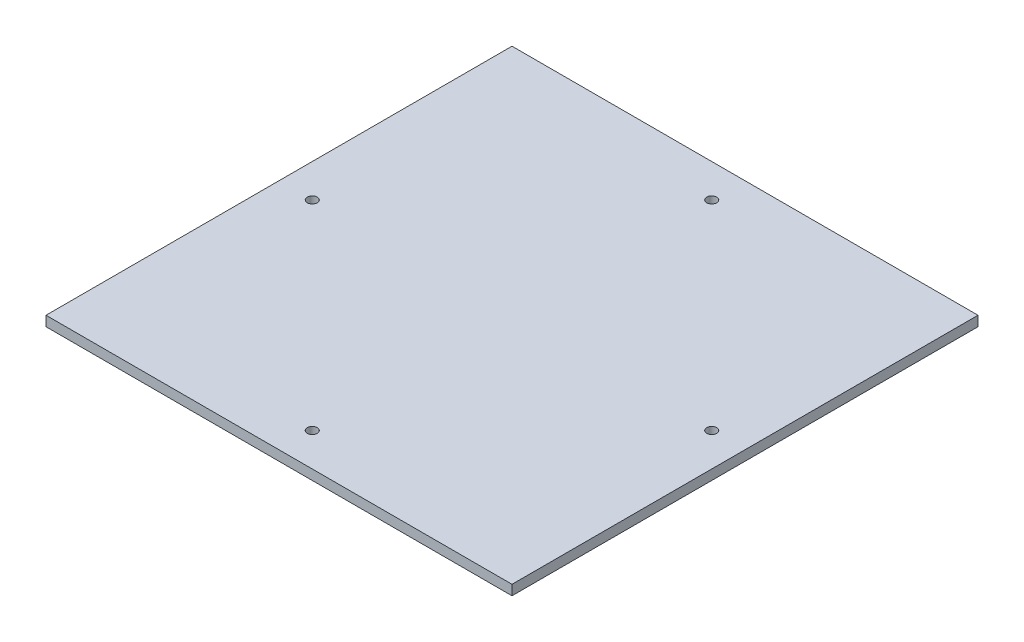
ISO-10303-21;
HEADER;
FILE_DESCRIPTION(('STEP AP214'),'2;1');
FILE_NAME('part.step','',(''),(''),'','','');
FILE_SCHEMA(('AUTOMOTIVE_DESIGN { 1 0 10303 214 1 1 1 1 }'));
ENDSEC;
DATA;
#1=APPLICATION_CONTEXT('core data for automotive mechanical design processes');
#2=APPLICATION_PROTOCOL_DEFINITION('international standard','automotive_design',2000,#1);
#3=PRODUCT_CONTEXT('',#1,'mechanical');
#4=PRODUCT('Part','Part','',(#3));
#5=PRODUCT_RELATED_PRODUCT_CATEGORY('part','',(#4));
#6=PRODUCT_DEFINITION_FORMATION('','',#4);
#7=PRODUCT_DEFINITION_CONTEXT('part definition',#1,'design');
#8=PRODUCT_DEFINITION('design','',#6,#7);
#9=PRODUCT_DEFINITION_SHAPE('','',#8);
#10=(LENGTH_UNIT() NAMED_UNIT(*) SI_UNIT(.MILLI.,.METRE.));
#11=(NAMED_UNIT(*) PLANE_ANGLE_UNIT() SI_UNIT($,.RADIAN.));
#12=(NAMED_UNIT(*) SI_UNIT($,.STERADIAN.) SOLID_ANGLE_UNIT());
#13=UNCERTAINTY_MEASURE_WITH_UNIT(LENGTH_MEASURE(1.E-05),#10,'distance_accuracy_value','');
#14=(GEOMETRIC_REPRESENTATION_CONTEXT(3) GLOBAL_UNCERTAINTY_ASSIGNED_CONTEXT((#13)) GLOBAL_UNIT_ASSIGNED_CONTEXT((#10,
#11,#12)) REPRESENTATION_CONTEXT('',''));
#15=CARTESIAN_POINT('',(0.,0.,0.));
#16=DIRECTION('',(0.,0.,1.));
#17=DIRECTION('',(1.,0.,0.));
#18=AXIS2_PLACEMENT_3D('',#15,#16,#17);
#19=CARTESIAN_POINT('',(-70.,3.,70.));
#20=DIRECTION('',(1.,0.,0.));
#21=DIRECTION('',(0.,0.,-1.));
#22=AXIS2_PLACEMENT_3D('',#19,#20,#21);
#23=PLANE('',#22);
#24=DIRECTION('',(0.,0.,1.));
#25=VECTOR('',#24,1.);
#26=CARTESIAN_POINT('',(-70.,0.,70.));
#27=LINE('',#26,#25);
#28=CARTESIAN_POINT('',(-70.,0.,-70.));
#29=VERTEX_POINT('',#28);
#30=CARTESIAN_POINT('',(-70.,0.,70.));
#31=VERTEX_POINT('',#30);
#32=EDGE_CURVE('E110',#29,#31,#27,.T.);
#33=ORIENTED_EDGE('',*,*,#32,.T.);
#34=DIRECTION('',(0.,-1.,0.));
#35=VECTOR('',#34,1.);
#36=CARTESIAN_POINT('',(-70.,3.,70.));
#37=LINE('',#36,#35);
#38=CARTESIAN_POINT('',(-70.,3.,70.));
#39=VERTEX_POINT('',#38);
#40=EDGE_CURVE('E11',#39,#31,#37,.T.);
#41=ORIENTED_EDGE('',*,*,#40,.F.);
#42=DIRECTION('',(0.,0.,1.));
#43=VECTOR('',#42,1.);
#44=CARTESIAN_POINT('',(-70.,3.,70.));
#45=LINE('',#44,#43);
#46=CARTESIAN_POINT('',(-70.,3.,-70.));
#47=VERTEX_POINT('',#46);
#48=EDGE_CURVE('E94',#47,#39,#45,.T.);
#49=ORIENTED_EDGE('',*,*,#48,.F.);
#50=DIRECTION('',(0.,-1.,0.));
#51=VECTOR('',#50,1.);
#52=CARTESIAN_POINT('',(-70.,3.,-70.));
#53=LINE('',#52,#51);
#54=EDGE_CURVE('E106',#47,#29,#53,.T.);
#55=ORIENTED_EDGE('',*,*,#54,.T.);
#56=EDGE_LOOP('',(#33,#41,#49,#55));
#57=FACE_BOUND('',#56,.T.);
#58=ADVANCED_FACE('F42',(#57),#23,.F.);
#59=CARTESIAN_POINT('',(70.,3.,70.));
#60=DIRECTION('',(0.,0.,-1.));
#61=DIRECTION('',(-1.,0.,0.));
#62=AXIS2_PLACEMENT_3D('',#59,#60,#61);
#63=PLANE('',#62);
#64=DIRECTION('',(1.,0.,0.));
#65=VECTOR('',#64,1.);
#66=CARTESIAN_POINT('',(70.,0.,70.));
#67=LINE('',#66,#65);
#68=CARTESIAN_POINT('',(70.,0.,70.));
#69=VERTEX_POINT('',#68);
#70=EDGE_CURVE('E99',#31,#69,#67,.T.);
#71=ORIENTED_EDGE('',*,*,#70,.T.);
#72=DIRECTION('',(0.,-1.,0.));
#73=VECTOR('',#72,1.);
#74=CARTESIAN_POINT('',(70.,3.,70.));
#75=LINE('',#74,#73);
#76=CARTESIAN_POINT('',(70.,3.,70.));
#77=VERTEX_POINT('',#76);
#78=EDGE_CURVE('E51',#77,#69,#75,.T.);
#79=ORIENTED_EDGE('',*,*,#78,.F.);
#80=DIRECTION('',(1.,0.,0.));
#81=VECTOR('',#80,1.);
#82=CARTESIAN_POINT('',(70.,3.,70.));
#83=LINE('',#82,#81);
#84=EDGE_CURVE('E89',#39,#77,#83,.T.);
#85=ORIENTED_EDGE('',*,*,#84,.F.);
#86=ORIENTED_EDGE('',*,*,#40,.T.);
#87=EDGE_LOOP('',(#71,#79,#85,#86));
#88=FACE_BOUND('',#87,.T.);
#89=ADVANCED_FACE('F98',(#88),#63,.F.);
#90=CARTESIAN_POINT('',(70.,3.,70.));
#91=DIRECTION('',(-1.,0.,0.));
#92=DIRECTION('',(0.,0.,1.));
#93=AXIS2_PLACEMENT_3D('',#90,#91,#92);
#94=PLANE('',#93);
#95=DIRECTION('',(0.,0.,-1.));
#96=VECTOR('',#95,1.);
#97=CARTESIAN_POINT('',(70.,0.,70.));
#98=LINE('',#97,#96);
#99=CARTESIAN_POINT('',(70.,0.,-70.));
#100=VERTEX_POINT('',#99);
#101=EDGE_CURVE('E76',#69,#100,#98,.T.);
#102=ORIENTED_EDGE('',*,*,#101,.T.);
#103=DIRECTION('',(0.,-1.,0.));
#104=VECTOR('',#103,1.);
#105=CARTESIAN_POINT('',(70.,3.,-70.));
#106=LINE('',#105,#104);
#107=CARTESIAN_POINT('',(70.,3.,-70.));
#108=VERTEX_POINT('',#107);
#109=EDGE_CURVE('E101',#108,#100,#106,.T.);
#110=ORIENTED_EDGE('',*,*,#109,.F.);
#111=DIRECTION('',(0.,0.,-1.));
#112=VECTOR('',#111,1.);
#113=CARTESIAN_POINT('',(70.,3.,70.));
#114=LINE('',#113,#112);
#115=EDGE_CURVE('E92',#77,#108,#114,.T.);
#116=ORIENTED_EDGE('',*,*,#115,.F.);
#117=ORIENTED_EDGE('',*,*,#78,.T.);
#118=EDGE_LOOP('',(#102,#110,#116,#117));
#119=FACE_BOUND('',#118,.T.);
#120=ADVANCED_FACE('F102',(#119),#94,.F.);
#121=CARTESIAN_POINT('',(70.,3.,-70.));
#122=DIRECTION('',(0.,0.,1.));
#123=DIRECTION('',(1.,0.,0.));
#124=AXIS2_PLACEMENT_3D('',#121,#122,#123);
#125=PLANE('',#124);
#126=DIRECTION('',(-1.,0.,0.));
#127=VECTOR('',#126,1.);
#128=CARTESIAN_POINT('',(70.,0.,-70.));
#129=LINE('',#128,#127);
#130=EDGE_CURVE('E82',#100,#29,#129,.T.);
#131=ORIENTED_EDGE('',*,*,#130,.T.);
#132=ORIENTED_EDGE('',*,*,#54,.F.);
#133=DIRECTION('',(-1.,0.,0.));
#134=VECTOR('',#133,1.);
#135=CARTESIAN_POINT('',(70.,3.,-70.));
#136=LINE('',#135,#134);
#137=EDGE_CURVE('E59',#108,#47,#136,.T.);
#138=ORIENTED_EDGE('',*,*,#137,.F.);
#139=ORIENTED_EDGE('',*,*,#109,.T.);
#140=EDGE_LOOP('',(#131,#132,#138,#139));
#141=FACE_BOUND('',#140,.T.);
#142=ADVANCED_FACE('F124',(#141),#125,.F.);
#143=CARTESIAN_POINT('',(0.,3.,0.));
#144=DIRECTION('',(0.,1.,0.));
#145=DIRECTION('',(0.,0.,1.));
#146=AXIS2_PLACEMENT_3D('',#143,#144,#145);
#147=PLANE('',#146);
#148=CARTESIAN_POINT('',(-6.42344428799579E-13,3.,-60.));
#149=DIRECTION('',(0.,1.,0.));
#150=DIRECTION('',(0.,0.,1.));
#151=AXIS2_PLACEMENT_3D('',#148,#149,#150);
#152=CIRCLE('',#151,1.5);
#153=CARTESIAN_POINT('',(-6.42344428799579E-13,3.,-58.5));
#154=VERTEX_POINT('',#153);
#155=EDGE_CURVE('E155',#154,#154,#152,.T.);
#156=ORIENTED_EDGE('',*,*,#155,.F.);
#157=EDGE_LOOP('',(#156));
#158=FACE_BOUND('',#157,.T.);
#159=CARTESIAN_POINT('',(60.,3.,-4.32855548468991E-13));
#160=DIRECTION('',(0.,1.,0.));
#161=DIRECTION('',(0.,0.,1.));
#162=AXIS2_PLACEMENT_3D('',#159,#160,#161);
#163=CIRCLE('',#162,1.5);
#164=CARTESIAN_POINT('',(60.,3.,1.49999999999956));
#165=VERTEX_POINT('',#164);
#166=EDGE_CURVE('E151',#165,#165,#163,.T.);
#167=ORIENTED_EDGE('',*,*,#166,.F.);
#168=EDGE_LOOP('',(#167));
#169=FACE_BOUND('',#168,.T.);
#170=CARTESIAN_POINT('',(2.23366668138402E-13,3.,60.));
#171=DIRECTION('',(0.,1.,0.));
#172=DIRECTION('',(0.,0.,1.));
#173=AXIS2_PLACEMENT_3D('',#170,#171,#172);
#174=CIRCLE('',#173,1.5);
#175=CARTESIAN_POINT('',(2.23366668138402E-13,3.,61.5));
#176=VERTEX_POINT('',#175);
#177=EDGE_CURVE('E143',#176,#176,#174,.T.);
#178=ORIENTED_EDGE('',*,*,#177,.F.);
#179=EDGE_LOOP('',(#178));
#180=FACE_BOUND('',#179,.T.);
#181=CARTESIAN_POINT('',(-60.,3.,0.));
#182=DIRECTION('',(0.,1.,0.));
#183=DIRECTION('',(0.,0.,1.));
#184=AXIS2_PLACEMENT_3D('',#181,#182,#183);
#185=CIRCLE('',#184,1.5);
#186=CARTESIAN_POINT('',(-60.,3.,1.50000000000001));
#187=VERTEX_POINT('',#186);
#188=EDGE_CURVE('E135',#187,#187,#185,.T.);
#189=ORIENTED_EDGE('',*,*,#188,.F.);
#190=EDGE_LOOP('',(#189));
#191=FACE_BOUND('',#190,.T.);
#192=ORIENTED_EDGE('',*,*,#48,.T.);
#193=ORIENTED_EDGE('',*,*,#84,.T.);
#194=ORIENTED_EDGE('',*,*,#115,.T.);
#195=ORIENTED_EDGE('',*,*,#137,.T.);
#196=EDGE_LOOP('',(#192,#193,#194,#195));
#197=FACE_BOUND('',#196,.T.);
#198=ADVANCED_FACE('F90',(#158,#169,#180,#191,#197),#147,.T.);
#199=CARTESIAN_POINT('',(0.,0.,0.));
#200=DIRECTION('',(0.,1.,0.));
#201=DIRECTION('',(0.,0.,1.));
#202=AXIS2_PLACEMENT_3D('',#199,#200,#201);
#203=PLANE('',#202);
#204=CARTESIAN_POINT('',(-6.42344428799579E-13,0.,-60.));
#205=DIRECTION('',(0.,1.,0.));
#206=DIRECTION('',(0.,0.,1.));
#207=AXIS2_PLACEMENT_3D('',#204,#205,#206);
#208=CIRCLE('',#207,1.5);
#209=CARTESIAN_POINT('',(-6.42344428799579E-13,0.,-58.5));
#210=VERTEX_POINT('',#209);
#211=EDGE_CURVE('E114',#210,#210,#208,.T.);
#212=ORIENTED_EDGE('',*,*,#211,.T.);
#213=EDGE_LOOP('',(#212));
#214=FACE_BOUND('',#213,.T.);
#215=CARTESIAN_POINT('',(60.,0.,-4.32855548468991E-13));
#216=DIRECTION('',(0.,1.,0.));
#217=DIRECTION('',(0.,0.,1.));
#218=AXIS2_PLACEMENT_3D('',#215,#216,#217);
#219=CIRCLE('',#218,1.5);
#220=CARTESIAN_POINT('',(60.,0.,1.49999999999956));
#221=VERTEX_POINT('',#220);
#222=EDGE_CURVE('E147',#221,#221,#219,.T.);
#223=ORIENTED_EDGE('',*,*,#222,.T.);
#224=EDGE_LOOP('',(#223));
#225=FACE_BOUND('',#224,.T.);
#226=CARTESIAN_POINT('',(2.23366668138402E-13,0.,60.));
#227=DIRECTION('',(0.,1.,0.));
#228=DIRECTION('',(0.,0.,1.));
#229=AXIS2_PLACEMENT_3D('',#226,#227,#228);
#230=CIRCLE('',#229,1.5);
#231=CARTESIAN_POINT('',(2.23366668138402E-13,0.,61.5));
#232=VERTEX_POINT('',#231);
#233=EDGE_CURVE('E139',#232,#232,#230,.T.);
#234=ORIENTED_EDGE('',*,*,#233,.T.);
#235=EDGE_LOOP('',(#234));
#236=FACE_BOUND('',#235,.T.);
#237=CARTESIAN_POINT('',(-60.,0.,0.));
#238=DIRECTION('',(0.,1.,0.));
#239=DIRECTION('',(0.,0.,1.));
#240=AXIS2_PLACEMENT_3D('',#237,#238,#239);
#241=CIRCLE('',#240,1.5);
#242=CARTESIAN_POINT('',(-60.,0.,1.50000000000001));
#243=VERTEX_POINT('',#242);
#244=EDGE_CURVE('E131',#243,#243,#241,.T.);
#245=ORIENTED_EDGE('',*,*,#244,.T.);
#246=EDGE_LOOP('',(#245));
#247=FACE_BOUND('',#246,.T.);
#248=ORIENTED_EDGE('',*,*,#32,.F.);
#249=ORIENTED_EDGE('',*,*,#130,.F.);
#250=ORIENTED_EDGE('',*,*,#101,.F.);
#251=ORIENTED_EDGE('',*,*,#70,.F.);
#252=EDGE_LOOP('',(#248,#249,#250,#251));
#253=FACE_BOUND('',#252,.T.);
#254=ADVANCED_FACE('F127',(#214,#225,#236,#247,#253),#203,.F.);
#255=CARTESIAN_POINT('',(-60.,0.,0.));
#256=DIRECTION('',(0.,1.,0.));
#257=DIRECTION('',(0.,0.,1.));
#258=AXIS2_PLACEMENT_3D('',#255,#256,#257);
#259=CYLINDRICAL_SURFACE('',#258,1.5);
#260=ORIENTED_EDGE('',*,*,#244,.F.);
#261=EDGE_LOOP('',(#260));
#262=FACE_BOUND('',#261,.T.);
#263=ORIENTED_EDGE('',*,*,#188,.T.);
#264=EDGE_LOOP('',(#263));
#265=FACE_BOUND('',#264,.T.);
#266=ADVANCED_FACE('F181',(#262,#265),#259,.F.);
#267=CARTESIAN_POINT('',(2.23366668138402E-13,0.,60.));
#268=DIRECTION('',(0.,1.,0.));
#269=DIRECTION('',(0.,0.,1.));
#270=AXIS2_PLACEMENT_3D('',#267,#268,#269);
#271=CYLINDRICAL_SURFACE('',#270,1.5);
#272=ORIENTED_EDGE('',*,*,#233,.F.);
#273=EDGE_LOOP('',(#272));
#274=FACE_BOUND('',#273,.T.);
#275=ORIENTED_EDGE('',*,*,#177,.T.);
#276=EDGE_LOOP('',(#275));
#277=FACE_BOUND('',#276,.T.);
#278=ADVANCED_FACE('F183',(#274,#277),#271,.F.);
#279=CARTESIAN_POINT('',(60.,0.,-4.32855548468991E-13));
#280=DIRECTION('',(0.,1.,0.));
#281=DIRECTION('',(0.,0.,1.));
#282=AXIS2_PLACEMENT_3D('',#279,#280,#281);
#283=CYLINDRICAL_SURFACE('',#282,1.5);
#284=ORIENTED_EDGE('',*,*,#222,.F.);
#285=EDGE_LOOP('',(#284));
#286=FACE_BOUND('',#285,.T.);
#287=ORIENTED_EDGE('',*,*,#166,.T.);
#288=EDGE_LOOP('',(#287));
#289=FACE_BOUND('',#288,.T.);
#290=ADVANCED_FACE('F168',(#286,#289),#283,.F.);
#291=CARTESIAN_POINT('',(-6.42344428799579E-13,0.,-60.));
#292=DIRECTION('',(0.,1.,0.));
#293=DIRECTION('',(0.,0.,1.));
#294=AXIS2_PLACEMENT_3D('',#291,#292,#293);
#295=CYLINDRICAL_SURFACE('',#294,1.5);
#296=ORIENTED_EDGE('',*,*,#211,.F.);
#297=EDGE_LOOP('',(#296));
#298=FACE_BOUND('',#297,.T.);
#299=ORIENTED_EDGE('',*,*,#155,.T.);
#300=EDGE_LOOP('',(#299));
#301=FACE_BOUND('',#300,.T.);
#302=ADVANCED_FACE('F165',(#298,#301),#295,.F.);
#303=CLOSED_SHELL('',(#58,#89,#120,#142,#198,#254,#266,#278,#290,#302));
#304=MANIFOLD_SOLID_BREP('B2',#303);
#305=ADVANCED_BREP_SHAPE_REPRESENTATION('',(#18,#304),#14);
#306=SHAPE_DEFINITION_REPRESENTATION(#9,#305);
ENDSEC;
END-ISO-10303-21;
